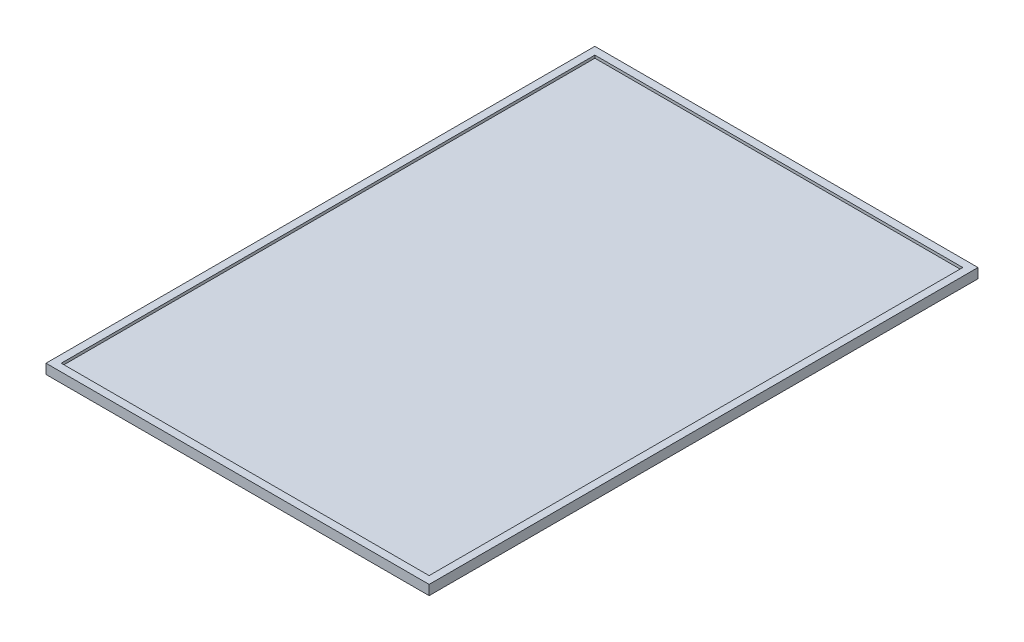
ISO-10303-21;
HEADER;
FILE_DESCRIPTION(('STEP AP214'),'2;1');
FILE_NAME('part.step','',(''),(''),'','','');
FILE_SCHEMA(('AUTOMOTIVE_DESIGN { 1 0 10303 214 1 1 1 1 }'));
ENDSEC;
DATA;
#1=APPLICATION_CONTEXT('core data for automotive mechanical design processes');
#2=APPLICATION_PROTOCOL_DEFINITION('international standard','automotive_design',2000,#1);
#3=PRODUCT_CONTEXT('',#1,'mechanical');
#4=PRODUCT('Part','Part','',(#3));
#5=PRODUCT_RELATED_PRODUCT_CATEGORY('part','',(#4));
#6=PRODUCT_DEFINITION_FORMATION('','',#4);
#7=PRODUCT_DEFINITION_CONTEXT('part definition',#1,'design');
#8=PRODUCT_DEFINITION('design','',#6,#7);
#9=PRODUCT_DEFINITION_SHAPE('','',#8);
#10=(LENGTH_UNIT() NAMED_UNIT(*) SI_UNIT(.MILLI.,.METRE.));
#11=(NAMED_UNIT(*) PLANE_ANGLE_UNIT() SI_UNIT($,.RADIAN.));
#12=(NAMED_UNIT(*) SI_UNIT($,.STERADIAN.) SOLID_ANGLE_UNIT());
#13=UNCERTAINTY_MEASURE_WITH_UNIT(LENGTH_MEASURE(1.E-05),#10,'distance_accuracy_value','');
#14=(GEOMETRIC_REPRESENTATION_CONTEXT(3) GLOBAL_UNCERTAINTY_ASSIGNED_CONTEXT((#13)) GLOBAL_UNIT_ASSIGNED_CONTEXT((#10,
#11,#12)) REPRESENTATION_CONTEXT('',''));
#15=CARTESIAN_POINT('',(0.,0.,0.));
#16=DIRECTION('',(0.,0.,1.));
#17=DIRECTION('',(1.,0.,0.));
#18=AXIS2_PLACEMENT_3D('',#15,#16,#17);
#19=CARTESIAN_POINT('',(352.5,18.,505.));
#20=DIRECTION('',(-1.,0.,0.));
#21=DIRECTION('',(0.,0.,1.));
#22=AXIS2_PLACEMENT_3D('',#19,#20,#21);
#23=PLANE('',#22);
#24=DIRECTION('',(0.,0.,-1.));
#25=VECTOR('',#24,1.);
#26=CARTESIAN_POINT('',(352.5,0.,505.));
#27=LINE('',#26,#25);
#28=CARTESIAN_POINT('',(352.5,0.,505.));
#29=VERTEX_POINT('',#28);
#30=CARTESIAN_POINT('',(352.5,0.,-505.));
#31=VERTEX_POINT('',#30);
#32=EDGE_CURVE('E188',#29,#31,#27,.T.);
#33=ORIENTED_EDGE('',*,*,#32,.T.);
#34=DIRECTION('',(0.,-1.,0.));
#35=VECTOR('',#34,1.);
#36=CARTESIAN_POINT('',(352.5,18.,-505.));
#37=LINE('',#36,#35);
#38=CARTESIAN_POINT('',(352.5,18.,-505.));
#39=VERTEX_POINT('',#38);
#40=EDGE_CURVE('E11',#39,#31,#37,.T.);
#41=ORIENTED_EDGE('',*,*,#40,.F.);
#42=DIRECTION('',(0.,0.,-1.));
#43=VECTOR('',#42,1.);
#44=CARTESIAN_POINT('',(352.5,18.,505.));
#45=LINE('',#44,#43);
#46=CARTESIAN_POINT('',(352.5,18.,505.));
#47=VERTEX_POINT('',#46);
#48=EDGE_CURVE('E194',#47,#39,#45,.T.);
#49=ORIENTED_EDGE('',*,*,#48,.F.);
#50=DIRECTION('',(0.,-1.,0.));
#51=VECTOR('',#50,1.);
#52=CARTESIAN_POINT('',(352.5,18.,505.));
#53=LINE('',#52,#51);
#54=EDGE_CURVE('E204',#47,#29,#53,.T.);
#55=ORIENTED_EDGE('',*,*,#54,.T.);
#56=EDGE_LOOP('',(#33,#41,#49,#55));
#57=FACE_BOUND('',#56,.T.);
#58=ADVANCED_FACE('F37',(#57),#23,.F.);
#59=CARTESIAN_POINT('',(-352.5,18.,-505.));
#60=DIRECTION('',(0.,0.,1.));
#61=DIRECTION('',(1.,0.,0.));
#62=AXIS2_PLACEMENT_3D('',#59,#60,#61);
#63=PLANE('',#62);
#64=DIRECTION('',(-1.,0.,0.));
#65=VECTOR('',#64,1.);
#66=CARTESIAN_POINT('',(-352.5,0.,-505.));
#67=LINE('',#66,#65);
#68=CARTESIAN_POINT('',(-352.5,0.,-505.));
#69=VERTEX_POINT('',#68);
#70=EDGE_CURVE('E207',#31,#69,#67,.T.);
#71=ORIENTED_EDGE('',*,*,#70,.T.);
#72=DIRECTION('',(0.,-1.,0.));
#73=VECTOR('',#72,1.);
#74=CARTESIAN_POINT('',(-352.5,18.,-505.));
#75=LINE('',#74,#73);
#76=CARTESIAN_POINT('',(-352.5,18.,-505.));
#77=VERTEX_POINT('',#76);
#78=EDGE_CURVE('E44',#77,#69,#75,.T.);
#79=ORIENTED_EDGE('',*,*,#78,.F.);
#80=DIRECTION('',(-1.,0.,0.));
#81=VECTOR('',#80,1.);
#82=CARTESIAN_POINT('',(-352.5,18.,-505.));
#83=LINE('',#82,#81);
#84=EDGE_CURVE('E197',#39,#77,#83,.T.);
#85=ORIENTED_EDGE('',*,*,#84,.F.);
#86=ORIENTED_EDGE('',*,*,#40,.T.);
#87=EDGE_LOOP('',(#71,#79,#85,#86));
#88=FACE_BOUND('',#87,.T.);
#89=ADVANCED_FACE('F237',(#88),#63,.F.);
#90=CARTESIAN_POINT('',(-352.5,18.,505.));
#91=DIRECTION('',(1.,0.,0.));
#92=DIRECTION('',(0.,0.,-1.));
#93=AXIS2_PLACEMENT_3D('',#90,#91,#92);
#94=PLANE('',#93);
#95=DIRECTION('',(0.,0.,1.));
#96=VECTOR('',#95,1.);
#97=CARTESIAN_POINT('',(-352.5,0.,505.));
#98=LINE('',#97,#96);
#99=CARTESIAN_POINT('',(-352.5,0.,505.));
#100=VERTEX_POINT('',#99);
#101=EDGE_CURVE('E209',#69,#100,#98,.T.);
#102=ORIENTED_EDGE('',*,*,#101,.T.);
#103=DIRECTION('',(0.,-1.,0.));
#104=VECTOR('',#103,1.);
#105=CARTESIAN_POINT('',(-352.5,18.,505.));
#106=LINE('',#105,#104);
#107=CARTESIAN_POINT('',(-352.5,18.,505.));
#108=VERTEX_POINT('',#107);
#109=EDGE_CURVE('E214',#108,#100,#106,.T.);
#110=ORIENTED_EDGE('',*,*,#109,.F.);
#111=DIRECTION('',(0.,0.,1.));
#112=VECTOR('',#111,1.);
#113=CARTESIAN_POINT('',(-352.5,18.,505.));
#114=LINE('',#113,#112);
#115=EDGE_CURVE('E200',#77,#108,#114,.T.);
#116=ORIENTED_EDGE('',*,*,#115,.F.);
#117=ORIENTED_EDGE('',*,*,#78,.T.);
#118=EDGE_LOOP('',(#102,#110,#116,#117));
#119=FACE_BOUND('',#118,.T.);
#120=ADVANCED_FACE('F221',(#119),#94,.F.);
#121=CARTESIAN_POINT('',(-352.5,18.,505.));
#122=DIRECTION('',(0.,0.,-1.));
#123=DIRECTION('',(-1.,0.,0.));
#124=AXIS2_PLACEMENT_3D('',#121,#122,#123);
#125=PLANE('',#124);
#126=DIRECTION('',(1.,0.,0.));
#127=VECTOR('',#126,1.);
#128=CARTESIAN_POINT('',(-352.5,0.,505.));
#129=LINE('',#128,#127);
#130=EDGE_CURVE('E198',#100,#29,#129,.T.);
#131=ORIENTED_EDGE('',*,*,#130,.T.);
#132=ORIENTED_EDGE('',*,*,#54,.F.);
#133=DIRECTION('',(1.,0.,0.));
#134=VECTOR('',#133,1.);
#135=CARTESIAN_POINT('',(-352.5,18.,505.));
#136=LINE('',#135,#134);
#137=EDGE_CURVE('E202',#108,#47,#136,.T.);
#138=ORIENTED_EDGE('',*,*,#137,.F.);
#139=ORIENTED_EDGE('',*,*,#109,.T.);
#140=EDGE_LOOP('',(#131,#132,#138,#139));
#141=FACE_BOUND('',#140,.T.);
#142=ADVANCED_FACE('F230',(#141),#125,.F.);
#143=CARTESIAN_POINT('',(0.,18.,0.));
#144=DIRECTION('',(0.,-1.,0.));
#145=DIRECTION('',(0.,0.,-1.));
#146=AXIS2_PLACEMENT_3D('',#143,#144,#145);
#147=PLANE('',#146);
#148=DIRECTION('',(-1.,0.,0.));
#149=VECTOR('',#148,1.);
#150=CARTESIAN_POINT('',(-338.5,18.,-491.));
#151=LINE('',#150,#149);
#152=CARTESIAN_POINT('',(338.5,18.,-491.));
#153=VERTEX_POINT('',#152);
#154=CARTESIAN_POINT('',(-338.5,18.,-491.));
#155=VERTEX_POINT('',#154);
#156=EDGE_CURVE('E178',#153,#155,#151,.T.);
#157=ORIENTED_EDGE('',*,*,#156,.F.);
#158=DIRECTION('',(0.,0.,-1.));
#159=VECTOR('',#158,1.);
#160=CARTESIAN_POINT('',(338.5,18.,491.));
#161=LINE('',#160,#159);
#162=CARTESIAN_POINT('',(338.5,18.,491.));
#163=VERTEX_POINT('',#162);
#164=EDGE_CURVE('E59',#163,#153,#161,.T.);
#165=ORIENTED_EDGE('',*,*,#164,.F.);
#166=DIRECTION('',(1.,0.,0.));
#167=VECTOR('',#166,1.);
#168=CARTESIAN_POINT('',(-338.5,18.,491.));
#169=LINE('',#168,#167);
#170=CARTESIAN_POINT('',(-338.5,18.,491.));
#171=VERTEX_POINT('',#170);
#172=EDGE_CURVE('E167',#171,#163,#169,.T.);
#173=ORIENTED_EDGE('',*,*,#172,.F.);
#174=DIRECTION('',(0.,0.,1.));
#175=VECTOR('',#174,1.);
#176=CARTESIAN_POINT('',(-338.5,18.,491.));
#177=LINE('',#176,#175);
#178=EDGE_CURVE('E181',#155,#171,#177,.T.);
#179=ORIENTED_EDGE('',*,*,#178,.F.);
#180=EDGE_LOOP('',(#157,#165,#173,#179));
#181=FACE_BOUND('',#180,.T.);
#182=ORIENTED_EDGE('',*,*,#48,.T.);
#183=ORIENTED_EDGE('',*,*,#84,.T.);
#184=ORIENTED_EDGE('',*,*,#115,.T.);
#185=ORIENTED_EDGE('',*,*,#137,.T.);
#186=EDGE_LOOP('',(#182,#183,#184,#185));
#187=FACE_BOUND('',#186,.T.);
#188=ADVANCED_FACE('F236',(#181,#187),#147,.F.);
#189=CARTESIAN_POINT('',(0.,0.,0.));
#190=DIRECTION('',(0.,-1.,0.));
#191=DIRECTION('',(0.,0.,-1.));
#192=AXIS2_PLACEMENT_3D('',#189,#190,#191);
#193=PLANE('',#192);
#194=DIRECTION('',(1.,0.,0.));
#195=VECTOR('',#194,1.);
#196=CARTESIAN_POINT('',(-338.,0.,-490.5));
#197=LINE('',#196,#195);
#198=CARTESIAN_POINT('',(-338.,0.,-490.5));
#199=VERTEX_POINT('',#198);
#200=CARTESIAN_POINT('',(338.,0.,-490.5));
#201=VERTEX_POINT('',#200);
#202=EDGE_CURVE('E51',#199,#201,#197,.T.);
#203=ORIENTED_EDGE('',*,*,#202,.F.);
#204=DIRECTION('',(0.,0.,-1.));
#205=VECTOR('',#204,1.);
#206=CARTESIAN_POINT('',(-338.,0.,490.5));
#207=LINE('',#206,#205);
#208=CARTESIAN_POINT('',(-338.,0.,490.5));
#209=VERTEX_POINT('',#208);
#210=EDGE_CURVE('E145',#209,#199,#207,.T.);
#211=ORIENTED_EDGE('',*,*,#210,.F.);
#212=DIRECTION('',(-1.,0.,0.));
#213=VECTOR('',#212,1.);
#214=CARTESIAN_POINT('',(338.,0.,490.5));
#215=LINE('',#214,#213);
#216=CARTESIAN_POINT('',(338.,0.,490.5));
#217=VERTEX_POINT('',#216);
#218=EDGE_CURVE('E148',#217,#209,#215,.T.);
#219=ORIENTED_EDGE('',*,*,#218,.F.);
#220=DIRECTION('',(0.,0.,1.));
#221=VECTOR('',#220,1.);
#222=CARTESIAN_POINT('',(338.,0.,-490.5));
#223=LINE('',#222,#221);
#224=EDGE_CURVE('E154',#201,#217,#223,.T.);
#225=ORIENTED_EDGE('',*,*,#224,.F.);
#226=EDGE_LOOP('',(#203,#211,#219,#225));
#227=FACE_BOUND('',#226,.T.);
#228=ORIENTED_EDGE('',*,*,#32,.F.);
#229=ORIENTED_EDGE('',*,*,#130,.F.);
#230=ORIENTED_EDGE('',*,*,#101,.F.);
#231=ORIENTED_EDGE('',*,*,#70,.F.);
#232=EDGE_LOOP('',(#228,#229,#230,#231));
#233=FACE_BOUND('',#232,.T.);
#234=ADVANCED_FACE('F227',(#227,#233),#193,.T.);
#235=CARTESIAN_POINT('',(338.5,13.,491.));
#236=DIRECTION('',(1.,0.,0.));
#237=DIRECTION('',(0.,0.,-1.));
#238=AXIS2_PLACEMENT_3D('',#235,#236,#237);
#239=PLANE('',#238);
#240=ORIENTED_EDGE('',*,*,#164,.T.);
#241=DIRECTION('',(0.,1.,0.));
#242=VECTOR('',#241,1.);
#243=CARTESIAN_POINT('',(338.5,13.,-491.));
#244=LINE('',#243,#242);
#245=CARTESIAN_POINT('',(338.5,13.,-491.));
#246=VERTEX_POINT('',#245);
#247=EDGE_CURVE('E176',#246,#153,#244,.T.);
#248=ORIENTED_EDGE('',*,*,#247,.F.);
#249=DIRECTION('',(0.,0.,-1.));
#250=VECTOR('',#249,1.);
#251=CARTESIAN_POINT('',(338.5,13.,491.));
#252=LINE('',#251,#250);
#253=CARTESIAN_POINT('',(338.5,13.,491.));
#254=VERTEX_POINT('',#253);
#255=EDGE_CURVE('E163',#254,#246,#252,.T.);
#256=ORIENTED_EDGE('',*,*,#255,.F.);
#257=DIRECTION('',(0.,1.,0.));
#258=VECTOR('',#257,1.);
#259=CARTESIAN_POINT('',(338.5,13.,491.));
#260=LINE('',#259,#258);
#261=EDGE_CURVE('E186',#254,#163,#260,.T.);
#262=ORIENTED_EDGE('',*,*,#261,.T.);
#263=EDGE_LOOP('',(#240,#248,#256,#262));
#264=FACE_BOUND('',#263,.T.);
#265=ADVANCED_FACE('F249',(#264),#239,.F.);
#266=CARTESIAN_POINT('',(-338.5,13.,491.));
#267=DIRECTION('',(0.,0.,1.));
#268=DIRECTION('',(1.,0.,0.));
#269=AXIS2_PLACEMENT_3D('',#266,#267,#268);
#270=PLANE('',#269);
#271=ORIENTED_EDGE('',*,*,#172,.T.);
#272=ORIENTED_EDGE('',*,*,#261,.F.);
#273=DIRECTION('',(1.,0.,0.));
#274=VECTOR('',#273,1.);
#275=CARTESIAN_POINT('',(-338.5,13.,491.));
#276=LINE('',#275,#274);
#277=CARTESIAN_POINT('',(-338.5,13.,491.));
#278=VERTEX_POINT('',#277);
#279=EDGE_CURVE('E173',#278,#254,#276,.T.);
#280=ORIENTED_EDGE('',*,*,#279,.F.);
#281=DIRECTION('',(0.,1.,0.));
#282=VECTOR('',#281,1.);
#283=CARTESIAN_POINT('',(-338.5,13.,491.));
#284=LINE('',#283,#282);
#285=EDGE_CURVE('E189',#278,#171,#284,.T.);
#286=ORIENTED_EDGE('',*,*,#285,.T.);
#287=EDGE_LOOP('',(#271,#272,#280,#286));
#288=FACE_BOUND('',#287,.T.);
#289=ADVANCED_FACE('F256',(#288),#270,.F.);
#290=CARTESIAN_POINT('',(-338.5,13.,491.));
#291=DIRECTION('',(-1.,0.,0.));
#292=DIRECTION('',(0.,0.,1.));
#293=AXIS2_PLACEMENT_3D('',#290,#291,#292);
#294=PLANE('',#293);
#295=ORIENTED_EDGE('',*,*,#178,.T.);
#296=ORIENTED_EDGE('',*,*,#285,.F.);
#297=DIRECTION('',(0.,0.,1.));
#298=VECTOR('',#297,1.);
#299=CARTESIAN_POINT('',(-338.5,13.,491.));
#300=LINE('',#299,#298);
#301=CARTESIAN_POINT('',(-338.5,13.,-491.));
#302=VERTEX_POINT('',#301);
#303=EDGE_CURVE('E170',#302,#278,#300,.T.);
#304=ORIENTED_EDGE('',*,*,#303,.F.);
#305=DIRECTION('',(0.,1.,0.));
#306=VECTOR('',#305,1.);
#307=CARTESIAN_POINT('',(-338.5,13.,-491.));
#308=LINE('',#307,#306);
#309=EDGE_CURVE('E191',#302,#155,#308,.T.);
#310=ORIENTED_EDGE('',*,*,#309,.T.);
#311=EDGE_LOOP('',(#295,#296,#304,#310));
#312=FACE_BOUND('',#311,.T.);
#313=ADVANCED_FACE('F261',(#312),#294,.F.);
#314=CARTESIAN_POINT('',(-338.5,13.,-491.));
#315=DIRECTION('',(0.,0.,-1.));
#316=DIRECTION('',(-1.,0.,0.));
#317=AXIS2_PLACEMENT_3D('',#314,#315,#316);
#318=PLANE('',#317);
#319=ORIENTED_EDGE('',*,*,#156,.T.);
#320=ORIENTED_EDGE('',*,*,#309,.F.);
#321=DIRECTION('',(-1.,0.,0.));
#322=VECTOR('',#321,1.);
#323=CARTESIAN_POINT('',(-338.5,13.,-491.));
#324=LINE('',#323,#322);
#325=EDGE_CURVE('E166',#246,#302,#324,.T.);
#326=ORIENTED_EDGE('',*,*,#325,.F.);
#327=ORIENTED_EDGE('',*,*,#247,.T.);
#328=EDGE_LOOP('',(#319,#320,#326,#327));
#329=FACE_BOUND('',#328,.T.);
#330=ADVANCED_FACE('F257',(#329),#318,.F.);
#331=CARTESIAN_POINT('',(0.,13.,0.));
#332=DIRECTION('',(0.,-1.,0.));
#333=DIRECTION('',(0.,0.,-1.));
#334=AXIS2_PLACEMENT_3D('',#331,#332,#333);
#335=PLANE('',#334);
#336=ORIENTED_EDGE('',*,*,#255,.T.);
#337=ORIENTED_EDGE('',*,*,#325,.T.);
#338=ORIENTED_EDGE('',*,*,#303,.T.);
#339=ORIENTED_EDGE('',*,*,#279,.T.);
#340=EDGE_LOOP('',(#336,#337,#338,#339));
#341=FACE_BOUND('',#340,.T.);
#342=ADVANCED_FACE('F260',(#341),#335,.F.);
#343=CARTESIAN_POINT('',(-338.,6.,-490.5));
#344=DIRECTION('',(0.,0.,-1.));
#345=DIRECTION('',(-1.,0.,0.));
#346=AXIS2_PLACEMENT_3D('',#343,#344,#345);
#347=PLANE('',#346);
#348=ORIENTED_EDGE('',*,*,#202,.T.);
#349=DIRECTION('',(0.,-1.,0.));
#350=VECTOR('',#349,1.);
#351=CARTESIAN_POINT('',(338.,6.,-490.5));
#352=LINE('',#351,#350);
#353=CARTESIAN_POINT('',(338.,6.,-490.5));
#354=VERTEX_POINT('',#353);
#355=EDGE_CURVE('E123',#354,#201,#352,.T.);
#356=ORIENTED_EDGE('',*,*,#355,.F.);
#357=DIRECTION('',(1.,0.,0.));
#358=VECTOR('',#357,1.);
#359=CARTESIAN_POINT('',(-338.,6.,-490.5));
#360=LINE('',#359,#358);
#361=CARTESIAN_POINT('',(-338.,6.,-490.5));
#362=VERTEX_POINT('',#361);
#363=EDGE_CURVE('E127',#362,#354,#360,.T.);
#364=ORIENTED_EDGE('',*,*,#363,.F.);
#365=DIRECTION('',(0.,-1.,0.));
#366=VECTOR('',#365,1.);
#367=CARTESIAN_POINT('',(-338.,6.,-490.5));
#368=LINE('',#367,#366);
#369=EDGE_CURVE('E158',#362,#199,#368,.T.);
#370=ORIENTED_EDGE('',*,*,#369,.T.);
#371=EDGE_LOOP('',(#348,#356,#364,#370));
#372=FACE_BOUND('',#371,.T.);
#373=ADVANCED_FACE('F125',(#372),#347,.F.);
#374=CARTESIAN_POINT('',(-338.,6.,490.5));
#375=DIRECTION('',(-1.,0.,0.));
#376=DIRECTION('',(0.,0.,1.));
#377=AXIS2_PLACEMENT_3D('',#374,#375,#376);
#378=PLANE('',#377);
#379=ORIENTED_EDGE('',*,*,#210,.T.);
#380=ORIENTED_EDGE('',*,*,#369,.F.);
#381=DIRECTION('',(0.,0.,-1.));
#382=VECTOR('',#381,1.);
#383=CARTESIAN_POINT('',(-338.,6.,490.5));
#384=LINE('',#383,#382);
#385=CARTESIAN_POINT('',(-338.,6.,490.5));
#386=VERTEX_POINT('',#385);
#387=EDGE_CURVE('E133',#386,#362,#384,.T.);
#388=ORIENTED_EDGE('',*,*,#387,.F.);
#389=DIRECTION('',(0.,-1.,0.));
#390=VECTOR('',#389,1.);
#391=CARTESIAN_POINT('',(-338.,6.,490.5));
#392=LINE('',#391,#390);
#393=EDGE_CURVE('E160',#386,#209,#392,.T.);
#394=ORIENTED_EDGE('',*,*,#393,.T.);
#395=EDGE_LOOP('',(#379,#380,#388,#394));
#396=FACE_BOUND('',#395,.T.);
#397=ADVANCED_FACE('F274',(#396),#378,.F.);
#398=CARTESIAN_POINT('',(338.,6.,490.5));
#399=DIRECTION('',(0.,0.,1.));
#400=DIRECTION('',(1.,0.,0.));
#401=AXIS2_PLACEMENT_3D('',#398,#399,#400);
#402=PLANE('',#401);
#403=ORIENTED_EDGE('',*,*,#218,.T.);
#404=ORIENTED_EDGE('',*,*,#393,.F.);
#405=DIRECTION('',(-1.,0.,0.));
#406=VECTOR('',#405,1.);
#407=CARTESIAN_POINT('',(338.,6.,490.5));
#408=LINE('',#407,#406);
#409=CARTESIAN_POINT('',(338.,6.,490.5));
#410=VERTEX_POINT('',#409);
#411=EDGE_CURVE('E141',#410,#386,#408,.T.);
#412=ORIENTED_EDGE('',*,*,#411,.F.);
#413=DIRECTION('',(0.,-1.,0.));
#414=VECTOR('',#413,1.);
#415=CARTESIAN_POINT('',(338.,6.,490.5));
#416=LINE('',#415,#414);
#417=EDGE_CURVE('E132',#410,#217,#416,.T.);
#418=ORIENTED_EDGE('',*,*,#417,.T.);
#419=EDGE_LOOP('',(#403,#404,#412,#418));
#420=FACE_BOUND('',#419,.T.);
#421=ADVANCED_FACE('F277',(#420),#402,.F.);
#422=CARTESIAN_POINT('',(338.,6.,-490.5));
#423=DIRECTION('',(1.,0.,0.));
#424=DIRECTION('',(0.,0.,-1.));
#425=AXIS2_PLACEMENT_3D('',#422,#423,#424);
#426=PLANE('',#425);
#427=ORIENTED_EDGE('',*,*,#224,.T.);
#428=ORIENTED_EDGE('',*,*,#417,.F.);
#429=DIRECTION('',(0.,0.,1.));
#430=VECTOR('',#429,1.);
#431=CARTESIAN_POINT('',(338.,6.,-490.5));
#432=LINE('',#431,#430);
#433=EDGE_CURVE('E136',#354,#410,#432,.T.);
#434=ORIENTED_EDGE('',*,*,#433,.F.);
#435=ORIENTED_EDGE('',*,*,#355,.T.);
#436=EDGE_LOOP('',(#427,#428,#434,#435));
#437=FACE_BOUND('',#436,.T.);
#438=ADVANCED_FACE('F137',(#437),#426,.F.);
#439=CARTESIAN_POINT('',(0.,6.,0.));
#440=DIRECTION('',(0.,-1.,0.));
#441=DIRECTION('',(0.,0.,-1.));
#442=AXIS2_PLACEMENT_3D('',#439,#440,#441);
#443=PLANE('',#442);
#444=ORIENTED_EDGE('',*,*,#363,.T.);
#445=ORIENTED_EDGE('',*,*,#433,.T.);
#446=ORIENTED_EDGE('',*,*,#411,.T.);
#447=ORIENTED_EDGE('',*,*,#387,.T.);
#448=EDGE_LOOP('',(#444,#445,#446,#447));
#449=FACE_BOUND('',#448,.T.);
#450=ADVANCED_FACE('F143',(#449),#443,.T.);
#451=CLOSED_SHELL('',(#58,#89,#120,#142,#188,#234,#265,#289,#313,#330,#342,#373,#397,#421,#438,#450));
#452=MANIFOLD_SOLID_BREP('B2',#451);
#453=ADVANCED_BREP_SHAPE_REPRESENTATION('',(#18,#452),#14);
#454=SHAPE_DEFINITION_REPRESENTATION(#9,#453);
ENDSEC;
END-ISO-10303-21;
